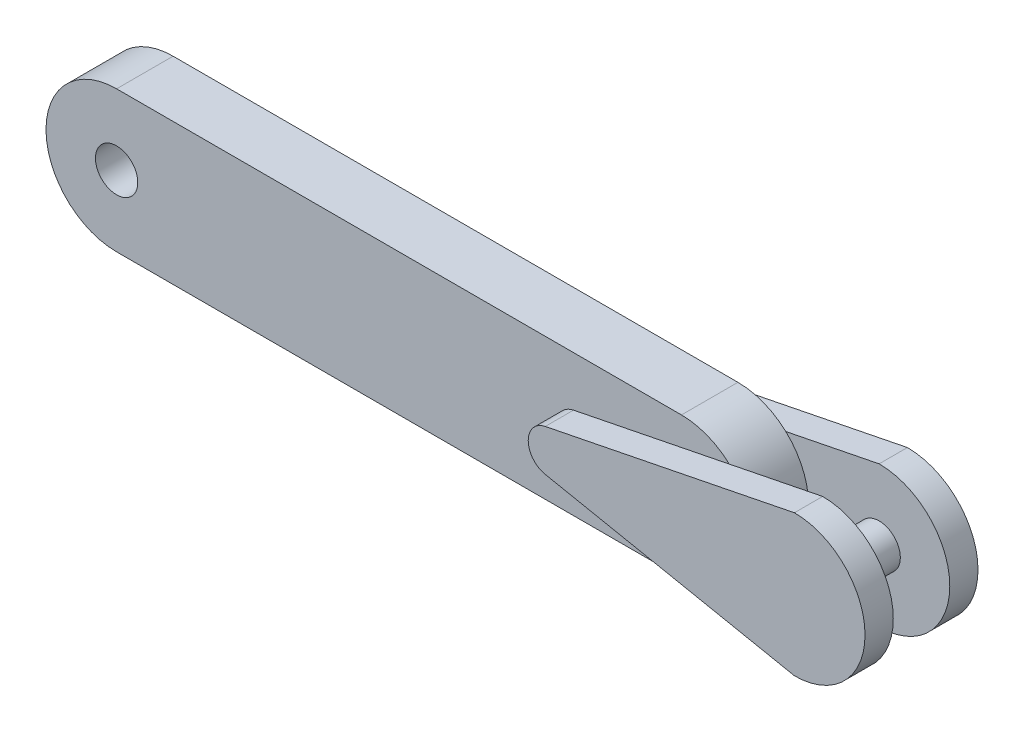
ISO-10303-21;
HEADER;
FILE_DESCRIPTION(('STEP AP214'),'2;1');
FILE_NAME('part.step','',(''),(''),'','','');
FILE_SCHEMA(('AUTOMOTIVE_DESIGN { 1 0 10303 214 1 1 1 1 }'));
ENDSEC;
DATA;
#1=APPLICATION_CONTEXT('core data for automotive mechanical design processes');
#2=APPLICATION_PROTOCOL_DEFINITION('international standard','automotive_design',2000,#1);
#3=PRODUCT_CONTEXT('',#1,'mechanical');
#4=PRODUCT('Part','Part','',(#3));
#5=PRODUCT_RELATED_PRODUCT_CATEGORY('part','',(#4));
#6=PRODUCT_DEFINITION_FORMATION('','',#4);
#7=PRODUCT_DEFINITION_CONTEXT('part definition',#1,'design');
#8=PRODUCT_DEFINITION('design','',#6,#7);
#9=PRODUCT_DEFINITION_SHAPE('','',#8);
#10=(LENGTH_UNIT() NAMED_UNIT(*) SI_UNIT(.MILLI.,.METRE.));
#11=(NAMED_UNIT(*) PLANE_ANGLE_UNIT() SI_UNIT($,.RADIAN.));
#12=(NAMED_UNIT(*) SI_UNIT($,.STERADIAN.) SOLID_ANGLE_UNIT());
#13=UNCERTAINTY_MEASURE_WITH_UNIT(LENGTH_MEASURE(1.E-05),#10,'distance_accuracy_value','');
#14=(GEOMETRIC_REPRESENTATION_CONTEXT(3) GLOBAL_UNCERTAINTY_ASSIGNED_CONTEXT((#13)) GLOBAL_UNIT_ASSIGNED_CONTEXT((#10,
#11,#12)) REPRESENTATION_CONTEXT('',''));
#15=CARTESIAN_POINT('',(0.,0.,0.));
#16=DIRECTION('',(0.,0.,1.));
#17=DIRECTION('',(1.,0.,0.));
#18=AXIS2_PLACEMENT_3D('',#15,#16,#17);
#19=CARTESIAN_POINT('',(0.,-50.,40.));
#20=DIRECTION('',(0.,1.,0.));
#21=DIRECTION('',(-1.,0.,0.));
#22=AXIS2_PLACEMENT_3D('',#19,#20,#21);
#23=PLANE('',#22);
#24=DIRECTION('',(-1.,0.,0.));
#25=VECTOR('',#24,1.);
#26=CARTESIAN_POINT('',(0.,-50.,-20.));
#27=LINE('',#26,#25);
#28=CARTESIAN_POINT('',(400.,-50.,-20.));
#29=VERTEX_POINT('',#28);
#30=CARTESIAN_POINT('',(0.,-50.,-20.));
#31=VERTEX_POINT('',#30);
#32=EDGE_CURVE('E143',#29,#31,#27,.T.);
#33=ORIENTED_EDGE('',*,*,#32,.F.);
#34=DIRECTION('',(0.,0.,1.));
#35=VECTOR('',#34,1.);
#36=CARTESIAN_POINT('',(400.,-50.,-20.));
#37=LINE('',#36,#35);
#38=CARTESIAN_POINT('',(400.,-50.,20.));
#39=VERTEX_POINT('',#38);
#40=EDGE_CURVE('E202',#29,#39,#37,.T.);
#41=ORIENTED_EDGE('',*,*,#40,.T.);
#42=DIRECTION('',(1.,0.,0.));
#43=VECTOR('',#42,1.);
#44=CARTESIAN_POINT('',(0.,-50.,20.));
#45=LINE('',#44,#43);
#46=CARTESIAN_POINT('',(0.,-50.,20.));
#47=VERTEX_POINT('',#46);
#48=EDGE_CURVE('E214',#47,#39,#45,.T.);
#49=ORIENTED_EDGE('',*,*,#48,.F.);
#50=DIRECTION('',(0.,0.,-1.));
#51=VECTOR('',#50,1.);
#52=CARTESIAN_POINT('',(0.,-50.,40.));
#53=LINE('',#52,#51);
#54=EDGE_CURVE('E175',#47,#31,#53,.T.);
#55=ORIENTED_EDGE('',*,*,#54,.T.);
#56=EDGE_LOOP('',(#33,#41,#49,#55));
#57=FACE_BOUND('',#56,.T.);
#58=ADVANCED_FACE('F38',(#57),#23,.F.);
#59=CARTESIAN_POINT('',(0.,50.,40.));
#60=DIRECTION('',(0.,-1.,0.));
#61=DIRECTION('',(1.,0.,0.));
#62=AXIS2_PLACEMENT_3D('',#59,#60,#61);
#63=PLANE('',#62);
#64=DIRECTION('',(1.,0.,0.));
#65=VECTOR('',#64,1.);
#66=CARTESIAN_POINT('',(500.,50.0000000000001,-20.));
#67=LINE('',#66,#65);
#68=CARTESIAN_POINT('',(0.,50.,-20.));
#69=VERTEX_POINT('',#68);
#70=CARTESIAN_POINT('',(400.,50.0000000000001,-20.));
#71=VERTEX_POINT('',#70);
#72=EDGE_CURVE('E140',#69,#71,#67,.T.);
#73=ORIENTED_EDGE('',*,*,#72,.F.);
#74=DIRECTION('',(0.,0.,-1.));
#75=VECTOR('',#74,1.);
#76=CARTESIAN_POINT('',(0.,50.,40.));
#77=LINE('',#76,#75);
#78=CARTESIAN_POINT('',(0.,50.,20.));
#79=VERTEX_POINT('',#78);
#80=EDGE_CURVE('E155',#79,#69,#77,.T.);
#81=ORIENTED_EDGE('',*,*,#80,.F.);
#82=DIRECTION('',(-1.,0.,0.));
#83=VECTOR('',#82,1.);
#84=CARTESIAN_POINT('',(500.,50.0000000000001,20.));
#85=LINE('',#84,#83);
#86=CARTESIAN_POINT('',(400.,50.0000000000001,20.));
#87=VERTEX_POINT('',#86);
#88=EDGE_CURVE('E237',#87,#79,#85,.T.);
#89=ORIENTED_EDGE('',*,*,#88,.F.);
#90=DIRECTION('',(0.,0.,1.));
#91=VECTOR('',#90,1.);
#92=CARTESIAN_POINT('',(400.,50.,-20.));
#93=LINE('',#92,#91);
#94=EDGE_CURVE('E157',#71,#87,#93,.T.);
#95=ORIENTED_EDGE('',*,*,#94,.F.);
#96=EDGE_LOOP('',(#73,#81,#89,#95));
#97=FACE_BOUND('',#96,.T.);
#98=ADVANCED_FACE('F153',(#97),#63,.F.);
#99=CARTESIAN_POINT('',(0.,0.,40.));
#100=DIRECTION('',(0.,0.,-1.));
#101=DIRECTION('',(-1.,0.,0.));
#102=AXIS2_PLACEMENT_3D('',#99,#100,#101);
#103=CYLINDRICAL_SURFACE('',#102,50.);
#104=CARTESIAN_POINT('',(0.,0.,-20.));
#105=DIRECTION('',(0.,0.,-1.));
#106=DIRECTION('',(-1.,0.,0.));
#107=AXIS2_PLACEMENT_3D('',#104,#105,#106);
#108=CIRCLE('',#107,50.);
#109=EDGE_CURVE('E137',#31,#69,#108,.T.);
#110=ORIENTED_EDGE('',*,*,#109,.F.);
#111=ORIENTED_EDGE('',*,*,#54,.F.);
#112=CARTESIAN_POINT('',(0.,0.,20.));
#113=DIRECTION('',(0.,0.,1.));
#114=DIRECTION('',(1.,0.,0.));
#115=AXIS2_PLACEMENT_3D('',#112,#113,#114);
#116=CIRCLE('',#115,50.);
#117=EDGE_CURVE('E160',#79,#47,#116,.T.);
#118=ORIENTED_EDGE('',*,*,#117,.F.);
#119=ORIENTED_EDGE('',*,*,#80,.T.);
#120=EDGE_LOOP('',(#110,#111,#118,#119));
#121=FACE_BOUND('',#120,.T.);
#122=ADVANCED_FACE('F40',(#121),#103,.T.);
#123=CARTESIAN_POINT('',(500.,0.,40.));
#124=DIRECTION('',(0.,0.,-1.));
#125=DIRECTION('',(-1.,0.,0.));
#126=AXIS2_PLACEMENT_3D('',#123,#124,#125);
#127=CYLINDRICAL_SURFACE('',#126,50.);
#128=CARTESIAN_POINT('',(500.,0.,-20.));
#129=DIRECTION('',(0.,0.,1.));
#130=DIRECTION('',(1.,0.,0.));
#131=AXIS2_PLACEMENT_3D('',#128,#129,#130);
#132=CIRCLE('',#131,50.);
#133=CARTESIAN_POINT('',(500.,-50.,-20.));
#134=VERTEX_POINT('',#133);
#135=CARTESIAN_POINT('',(500.,50.0000000000001,-20.));
#136=VERTEX_POINT('',#135);
#137=EDGE_CURVE('E197',#134,#136,#132,.T.);
#138=ORIENTED_EDGE('',*,*,#137,.F.);
#139=DIRECTION('',(0.,0.,-1.));
#140=VECTOR('',#139,1.);
#141=CARTESIAN_POINT('',(500.,-50.,40.));
#142=LINE('',#141,#140);
#143=CARTESIAN_POINT('',(500.,-50.,-40.));
#144=VERTEX_POINT('',#143);
#145=EDGE_CURVE('E171',#134,#144,#142,.T.);
#146=ORIENTED_EDGE('',*,*,#145,.T.);
#147=CARTESIAN_POINT('',(500.,0.,-40.));
#148=DIRECTION('',(0.,0.,1.));
#149=DIRECTION('',(1.,0.,0.));
#150=AXIS2_PLACEMENT_3D('',#147,#148,#149);
#151=CIRCLE('',#150,50.);
#152=CARTESIAN_POINT('',(500.,50.0000000000001,-40.));
#153=VERTEX_POINT('',#152);
#154=EDGE_CURVE('E167',#144,#153,#151,.T.);
#155=ORIENTED_EDGE('',*,*,#154,.T.);
#156=DIRECTION('',(0.,0.,-1.));
#157=VECTOR('',#156,1.);
#158=CARTESIAN_POINT('',(500.,50.0000000000001,40.));
#159=LINE('',#158,#157);
#160=EDGE_CURVE('E161',#136,#153,#159,.T.);
#161=ORIENTED_EDGE('',*,*,#160,.F.);
#162=EDGE_LOOP('',(#138,#146,#155,#161));
#163=FACE_BOUND('',#162,.T.);
#164=ADVANCED_FACE('F264',(#163),#127,.T.);
#165=CARTESIAN_POINT('',(500.,-50.,40.));
#166=VERTEX_POINT('',#165);
#167=CARTESIAN_POINT('',(500.,-50.,20.));
#168=VERTEX_POINT('',#167);
#169=EDGE_CURVE('E172',#166,#168,#142,.T.);
#170=ORIENTED_EDGE('',*,*,#169,.T.);
#171=CARTESIAN_POINT('',(500.,0.,20.));
#172=DIRECTION('',(0.,0.,1.));
#173=DIRECTION('',(1.,0.,0.));
#174=AXIS2_PLACEMENT_3D('',#171,#172,#173);
#175=CIRCLE('',#174,50.);
#176=CARTESIAN_POINT('',(500.,50.0000000000001,20.));
#177=VERTEX_POINT('',#176);
#178=EDGE_CURVE('E206',#168,#177,#175,.T.);
#179=ORIENTED_EDGE('',*,*,#178,.T.);
#180=CARTESIAN_POINT('',(500.,50.0000000000001,40.));
#181=VERTEX_POINT('',#180);
#182=EDGE_CURVE('E164',#181,#177,#159,.T.);
#183=ORIENTED_EDGE('',*,*,#182,.F.);
#184=CARTESIAN_POINT('',(500.,0.,40.));
#185=DIRECTION('',(0.,0.,1.));
#186=DIRECTION('',(1.,0.,0.));
#187=AXIS2_PLACEMENT_3D('',#184,#185,#186);
#188=CIRCLE('',#187,50.);
#189=EDGE_CURVE('E162',#166,#181,#188,.T.);
#190=ORIENTED_EDGE('',*,*,#189,.F.);
#191=EDGE_LOOP('',(#170,#179,#183,#190));
#192=FACE_BOUND('',#191,.T.);
#193=ADVANCED_FACE('F262',(#192),#127,.T.);
#194=CARTESIAN_POINT('',(0.,0.,40.));
#195=DIRECTION('',(0.,0.,1.));
#196=DIRECTION('',(1.,0.,0.));
#197=AXIS2_PLACEMENT_3D('',#194,#195,#196);
#198=PLANE('',#197);
#199=DIRECTION('',(0.98058067569092,0.196116135138184,0.));
#200=VECTOR('',#199,1.);
#201=CARTESIAN_POINT('',(500.,50.0000000000001,40.));
#202=LINE('',#201,#200);
#203=CARTESIAN_POINT('',(323.543550676819,14.7087101353639,40.));
#204=VERTEX_POINT('',#203);
#205=EDGE_CURVE('E246',#204,#181,#202,.T.);
#206=ORIENTED_EDGE('',*,*,#205,.F.);
#207=CARTESIAN_POINT('',(326.485292703892,0.,40.));
#208=DIRECTION('',(0.,0.,-1.));
#209=DIRECTION('',(1.,0.,0.));
#210=AXIS2_PLACEMENT_3D('',#207,#208,#209);
#211=CIRCLE('',#210,15.0000000000001);
#212=CARTESIAN_POINT('',(323.543550676819,-14.7087101353639,40.));
#213=VERTEX_POINT('',#212);
#214=EDGE_CURVE('E242',#213,#204,#211,.T.);
#215=ORIENTED_EDGE('',*,*,#214,.F.);
#216=DIRECTION('',(-0.98058067569092,0.196116135138184,0.));
#217=VECTOR('',#216,1.);
#218=CARTESIAN_POINT('',(323.543550676819,-14.7087101353639,40.));
#219=LINE('',#218,#217);
#220=EDGE_CURVE('E239',#166,#213,#219,.T.);
#221=ORIENTED_EDGE('',*,*,#220,.F.);
#222=ORIENTED_EDGE('',*,*,#189,.T.);
#223=EDGE_LOOP('',(#206,#215,#221,#222));
#224=FACE_BOUND('',#223,.T.);
#225=ADVANCED_FACE('F258',(#224),#198,.T.);
#226=CARTESIAN_POINT('',(0.,0.,-40.));
#227=DIRECTION('',(0.,0.,1.));
#228=DIRECTION('',(1.,0.,0.));
#229=AXIS2_PLACEMENT_3D('',#226,#227,#228);
#230=PLANE('',#229);
#231=ORIENTED_EDGE('',*,*,#154,.F.);
#232=DIRECTION('',(0.98058067569092,-0.196116135138184,0.));
#233=VECTOR('',#232,1.);
#234=CARTESIAN_POINT('',(323.543550676819,-14.7087101353638,-40.));
#235=LINE('',#234,#233);
#236=CARTESIAN_POINT('',(323.543550676819,-14.7087101353638,-40.));
#237=VERTEX_POINT('',#236);
#238=EDGE_CURVE('E148',#237,#144,#235,.T.);
#239=ORIENTED_EDGE('',*,*,#238,.F.);
#240=CARTESIAN_POINT('',(326.485292703892,0.,-40.));
#241=DIRECTION('',(0.,0.,1.));
#242=DIRECTION('',(-1.,0.,0.));
#243=AXIS2_PLACEMENT_3D('',#240,#241,#242);
#244=CIRCLE('',#243,15.);
#245=CARTESIAN_POINT('',(323.543550676819,14.7087101353638,-40.));
#246=VERTEX_POINT('',#245);
#247=EDGE_CURVE('E349',#246,#237,#244,.T.);
#248=ORIENTED_EDGE('',*,*,#247,.F.);
#249=DIRECTION('',(-0.98058067569092,-0.196116135138184,0.));
#250=VECTOR('',#249,1.);
#251=CARTESIAN_POINT('',(500.,50.0000000000001,-40.));
#252=LINE('',#251,#250);
#253=EDGE_CURVE('E333',#153,#246,#252,.T.);
#254=ORIENTED_EDGE('',*,*,#253,.F.);
#255=EDGE_LOOP('',(#231,#239,#248,#254));
#256=FACE_BOUND('',#255,.T.);
#257=ADVANCED_FACE('F270',(#256),#230,.F.);
#258=CARTESIAN_POINT('',(400.,0.,-20.));
#259=DIRECTION('',(0.,0.,1.));
#260=DIRECTION('',(1.,0.,0.));
#261=AXIS2_PLACEMENT_3D('',#258,#259,#260);
#262=CYLINDRICAL_SURFACE('',#261,50.);
#263=CARTESIAN_POINT('',(400.,0.,20.));
#264=DIRECTION('',(0.,0.,-1.));
#265=DIRECTION('',(1.,0.,0.));
#266=AXIS2_PLACEMENT_3D('',#263,#264,#265);
#267=CIRCLE('',#266,50.);
#268=CARTESIAN_POINT('',(433.876015630939,36.7752031261879,20.));
#269=VERTEX_POINT('',#268);
#270=EDGE_CURVE('E203',#87,#269,#267,.T.);
#271=ORIENTED_EDGE('',*,*,#270,.T.);
#272=CARTESIAN_POINT('',(433.876015630939,-36.7752031261879,20.));
#273=VERTEX_POINT('',#272);
#274=EDGE_CURVE('E207',#269,#273,#267,.T.);
#275=ORIENTED_EDGE('',*,*,#274,.T.);
#276=EDGE_CURVE('E180',#273,#39,#267,.T.);
#277=ORIENTED_EDGE('',*,*,#276,.T.);
#278=ORIENTED_EDGE('',*,*,#40,.F.);
#279=CARTESIAN_POINT('',(400.,0.,-20.));
#280=DIRECTION('',(0.,0.,-1.));
#281=DIRECTION('',(1.,0.,0.));
#282=AXIS2_PLACEMENT_3D('',#279,#280,#281);
#283=CIRCLE('',#282,50.);
#284=CARTESIAN_POINT('',(433.876015630939,-36.7752031261878,-20.));
#285=VERTEX_POINT('',#284);
#286=EDGE_CURVE('E199',#285,#29,#283,.T.);
#287=ORIENTED_EDGE('',*,*,#286,.F.);
#288=CARTESIAN_POINT('',(433.876015630939,36.7752031261879,-20.));
#289=VERTEX_POINT('',#288);
#290=EDGE_CURVE('E198',#289,#285,#283,.T.);
#291=ORIENTED_EDGE('',*,*,#290,.F.);
#292=EDGE_CURVE('E195',#71,#289,#283,.T.);
#293=ORIENTED_EDGE('',*,*,#292,.F.);
#294=ORIENTED_EDGE('',*,*,#94,.T.);
#295=EDGE_LOOP('',(#271,#275,#277,#278,#287,#291,#293,#294));
#296=FACE_BOUND('',#295,.T.);
#297=ADVANCED_FACE('F218',(#296),#262,.T.);
#298=CARTESIAN_POINT('',(400.,0.,-20.));
#299=DIRECTION('',(0.,0.,1.));
#300=DIRECTION('',(1.,0.,0.));
#301=AXIS2_PLACEMENT_3D('',#298,#299,#300);
#302=PLANE('',#301);
#303=DIRECTION('',(-0.98058067569092,0.196116135138184,0.));
#304=VECTOR('',#303,1.);
#305=CARTESIAN_POINT('',(394.230769230769,-28.8461538461539,-20.));
#306=LINE('',#305,#304);
#307=EDGE_CURVE('E11',#134,#285,#306,.T.);
#308=ORIENTED_EDGE('',*,*,#307,.F.);
#309=ORIENTED_EDGE('',*,*,#137,.T.);
#310=DIRECTION('',(-0.98058067569092,-0.196116135138184,0.));
#311=VECTOR('',#310,1.);
#312=CARTESIAN_POINT('',(500.,50.0000000000001,-20.));
#313=LINE('',#312,#311);
#314=EDGE_CURVE('E336',#136,#289,#313,.T.);
#315=ORIENTED_EDGE('',*,*,#314,.T.);
#316=ORIENTED_EDGE('',*,*,#290,.T.);
#317=EDGE_LOOP('',(#308,#309,#315,#316));
#318=FACE_BOUND('',#317,.T.);
#319=CARTESIAN_POINT('',(500.,0.,-20.));
#320=DIRECTION('',(0.,0.,1.));
#321=DIRECTION('',(1.,0.,0.));
#322=AXIS2_PLACEMENT_3D('',#319,#320,#321);
#323=CIRCLE('',#322,15.);
#324=CARTESIAN_POINT('',(515.,0.,-20.));
#325=VERTEX_POINT('',#324);
#326=EDGE_CURVE('E177',#325,#325,#323,.T.);
#327=ORIENTED_EDGE('',*,*,#326,.F.);
#328=EDGE_LOOP('',(#327));
#329=FACE_BOUND('',#328,.T.);
#330=ADVANCED_FACE('F287',(#318,#329),#302,.T.);
#331=CARTESIAN_POINT('',(400.,0.,20.));
#332=DIRECTION('',(0.,0.,1.));
#333=DIRECTION('',(1.,0.,0.));
#334=AXIS2_PLACEMENT_3D('',#331,#332,#333);
#335=PLANE('',#334);
#336=CARTESIAN_POINT('',(500.,0.,20.));
#337=DIRECTION('',(0.,0.,1.));
#338=DIRECTION('',(1.,0.,0.));
#339=AXIS2_PLACEMENT_3D('',#336,#337,#338);
#340=CIRCLE('',#339,15.);
#341=CARTESIAN_POINT('',(515.,0.,20.));
#342=VERTEX_POINT('',#341);
#343=EDGE_CURVE('E178',#342,#342,#340,.T.);
#344=ORIENTED_EDGE('',*,*,#343,.T.);
#345=EDGE_LOOP('',(#344));
#346=FACE_BOUND('',#345,.T.);
#347=ORIENTED_EDGE('',*,*,#274,.F.);
#348=DIRECTION('',(0.98058067569092,0.196116135138184,0.));
#349=VECTOR('',#348,1.);
#350=CARTESIAN_POINT('',(394.230769230769,28.846153846154,20.));
#351=LINE('',#350,#349);
#352=EDGE_CURVE('E46',#269,#177,#351,.T.);
#353=ORIENTED_EDGE('',*,*,#352,.T.);
#354=ORIENTED_EDGE('',*,*,#178,.F.);
#355=DIRECTION('',(-0.98058067569092,0.196116135138184,0.));
#356=VECTOR('',#355,1.);
#357=CARTESIAN_POINT('',(323.543550676819,-14.7087101353639,20.));
#358=LINE('',#357,#356);
#359=EDGE_CURVE('E226',#168,#273,#358,.T.);
#360=ORIENTED_EDGE('',*,*,#359,.T.);
#361=EDGE_LOOP('',(#347,#353,#354,#360));
#362=FACE_BOUND('',#361,.T.);
#363=ADVANCED_FACE('F227',(#346,#362),#335,.F.);
#364=CARTESIAN_POINT('',(500.,0.,-40.));
#365=DIRECTION('',(0.,0.,1.));
#366=DIRECTION('',(1.,0.,0.));
#367=AXIS2_PLACEMENT_3D('',#364,#365,#366);
#368=CYLINDRICAL_SURFACE('',#367,15.);
#369=ORIENTED_EDGE('',*,*,#326,.T.);
#370=EDGE_LOOP('',(#369));
#371=FACE_BOUND('',#370,.T.);
#372=ORIENTED_EDGE('',*,*,#343,.F.);
#373=EDGE_LOOP('',(#372));
#374=FACE_BOUND('',#373,.T.);
#375=ADVANCED_FACE('F290',(#371,#374),#368,.T.);
#376=CARTESIAN_POINT('',(0.,0.,20.));
#377=DIRECTION('',(0.,0.,1.));
#378=DIRECTION('',(1.,0.,0.));
#379=AXIS2_PLACEMENT_3D('',#376,#377,#378);
#380=PLANE('',#379);
#381=CARTESIAN_POINT('',(0.,0.,20.));
#382=DIRECTION('',(0.,0.,-1.));
#383=DIRECTION('',(-1.,0.,0.));
#384=AXIS2_PLACEMENT_3D('',#381,#382,#383);
#385=CIRCLE('',#384,15.);
#386=CARTESIAN_POINT('',(-15.,0.,20.));
#387=VERTEX_POINT('',#386);
#388=EDGE_CURVE('E328',#387,#387,#385,.T.);
#389=ORIENTED_EDGE('',*,*,#388,.T.);
#390=EDGE_LOOP('',(#389));
#391=FACE_BOUND('',#390,.T.);
#392=ORIENTED_EDGE('',*,*,#270,.F.);
#393=ORIENTED_EDGE('',*,*,#88,.T.);
#394=ORIENTED_EDGE('',*,*,#117,.T.);
#395=ORIENTED_EDGE('',*,*,#48,.T.);
#396=ORIENTED_EDGE('',*,*,#276,.F.);
#397=CARTESIAN_POINT('',(323.543550676819,-14.7087101353639,20.));
#398=VERTEX_POINT('',#397);
#399=EDGE_CURVE('E61',#273,#398,#358,.T.);
#400=ORIENTED_EDGE('',*,*,#399,.T.);
#401=CARTESIAN_POINT('',(326.485292703892,0.,20.));
#402=DIRECTION('',(0.,0.,-1.));
#403=DIRECTION('',(1.,0.,0.));
#404=AXIS2_PLACEMENT_3D('',#401,#402,#403);
#405=CIRCLE('',#404,15.0000000000001);
#406=CARTESIAN_POINT('',(323.543550676819,14.7087101353639,20.));
#407=VERTEX_POINT('',#406);
#408=EDGE_CURVE('E228',#398,#407,#405,.T.);
#409=ORIENTED_EDGE('',*,*,#408,.T.);
#410=DIRECTION('',(0.98058067569092,0.196116135138184,0.));
#411=VECTOR('',#410,1.);
#412=CARTESIAN_POINT('',(500.,50.0000000000001,20.));
#413=LINE('',#412,#411);
#414=EDGE_CURVE('E230',#407,#269,#413,.T.);
#415=ORIENTED_EDGE('',*,*,#414,.T.);
#416=EDGE_LOOP('',(#392,#393,#394,#395,#396,#400,#409,#415));
#417=FACE_BOUND('',#416,.T.);
#418=ADVANCED_FACE('F224',(#391,#417),#380,.T.);
#419=CARTESIAN_POINT('',(500.,50.0000000000001,20.));
#420=DIRECTION('',(0.196116135138184,-0.98058067569092,0.));
#421=DIRECTION('',(0.98058067569092,0.196116135138184,0.));
#422=AXIS2_PLACEMENT_3D('',#419,#420,#421);
#423=PLANE('',#422);
#424=ORIENTED_EDGE('',*,*,#205,.T.);
#425=ORIENTED_EDGE('',*,*,#182,.T.);
#426=ORIENTED_EDGE('',*,*,#352,.F.);
#427=ORIENTED_EDGE('',*,*,#414,.F.);
#428=DIRECTION('',(0.,0.,1.));
#429=VECTOR('',#428,1.);
#430=CARTESIAN_POINT('',(323.543550676819,14.7087101353639,20.));
#431=LINE('',#430,#429);
#432=EDGE_CURVE('E181',#407,#204,#431,.T.);
#433=ORIENTED_EDGE('',*,*,#432,.T.);
#434=EDGE_LOOP('',(#424,#425,#426,#427,#433));
#435=FACE_BOUND('',#434,.T.);
#436=ADVANCED_FACE('F260',(#435),#423,.F.);
#437=CARTESIAN_POINT('',(326.485292703892,0.,20.));
#438=DIRECTION('',(0.,0.,1.));
#439=DIRECTION('',(1.,0.,0.));
#440=AXIS2_PLACEMENT_3D('',#437,#438,#439);
#441=CYLINDRICAL_SURFACE('',#440,15.0000000000001);
#442=ORIENTED_EDGE('',*,*,#214,.T.);
#443=ORIENTED_EDGE('',*,*,#432,.F.);
#444=ORIENTED_EDGE('',*,*,#408,.F.);
#445=DIRECTION('',(0.,0.,1.));
#446=VECTOR('',#445,1.);
#447=CARTESIAN_POINT('',(323.543550676819,-14.7087101353639,20.));
#448=LINE('',#447,#446);
#449=EDGE_CURVE('E193',#398,#213,#448,.T.);
#450=ORIENTED_EDGE('',*,*,#449,.T.);
#451=EDGE_LOOP('',(#442,#443,#444,#450));
#452=FACE_BOUND('',#451,.T.);
#453=ADVANCED_FACE('F251',(#452),#441,.T.);
#454=CARTESIAN_POINT('',(323.543550676819,-14.7087101353639,20.));
#455=DIRECTION('',(0.196116135138184,0.98058067569092,0.));
#456=DIRECTION('',(-0.98058067569092,0.196116135138184,0.));
#457=AXIS2_PLACEMENT_3D('',#454,#455,#456);
#458=PLANE('',#457);
#459=ORIENTED_EDGE('',*,*,#220,.T.);
#460=ORIENTED_EDGE('',*,*,#449,.F.);
#461=ORIENTED_EDGE('',*,*,#399,.F.);
#462=ORIENTED_EDGE('',*,*,#359,.F.);
#463=ORIENTED_EDGE('',*,*,#169,.F.);
#464=EDGE_LOOP('',(#459,#460,#461,#462,#463));
#465=FACE_BOUND('',#464,.T.);
#466=ADVANCED_FACE('F255',(#465),#458,.F.);
#467=CARTESIAN_POINT('',(0.,0.,-20.));
#468=DIRECTION('',(0.,0.,-1.));
#469=DIRECTION('',(-1.,0.,0.));
#470=AXIS2_PLACEMENT_3D('',#467,#468,#469);
#471=PLANE('',#470);
#472=CARTESIAN_POINT('',(0.,0.,-20.));
#473=DIRECTION('',(0.,0.,-1.));
#474=DIRECTION('',(-1.,0.,0.));
#475=AXIS2_PLACEMENT_3D('',#472,#473,#474);
#476=CIRCLE('',#475,15.);
#477=CARTESIAN_POINT('',(-15.,0.,-20.));
#478=VERTEX_POINT('',#477);
#479=EDGE_CURVE('E331',#478,#478,#476,.T.);
#480=ORIENTED_EDGE('',*,*,#479,.F.);
#481=EDGE_LOOP('',(#480));
#482=FACE_BOUND('',#481,.T.);
#483=ORIENTED_EDGE('',*,*,#292,.T.);
#484=CARTESIAN_POINT('',(323.543550676819,14.7087101353638,-20.));
#485=VERTEX_POINT('',#484);
#486=EDGE_CURVE('E53',#289,#485,#313,.T.);
#487=ORIENTED_EDGE('',*,*,#486,.T.);
#488=CARTESIAN_POINT('',(326.485292703892,0.,-20.));
#489=DIRECTION('',(0.,0.,1.));
#490=DIRECTION('',(-1.,0.,0.));
#491=AXIS2_PLACEMENT_3D('',#488,#489,#490);
#492=CIRCLE('',#491,15.);
#493=CARTESIAN_POINT('',(323.543550676819,-14.7087101353638,-20.));
#494=VERTEX_POINT('',#493);
#495=EDGE_CURVE('E339',#485,#494,#492,.T.);
#496=ORIENTED_EDGE('',*,*,#495,.T.);
#497=DIRECTION('',(0.98058067569092,-0.196116135138184,0.));
#498=VECTOR('',#497,1.);
#499=CARTESIAN_POINT('',(323.543550676819,-14.7087101353638,-20.));
#500=LINE('',#499,#498);
#501=EDGE_CURVE('E342',#494,#285,#500,.T.);
#502=ORIENTED_EDGE('',*,*,#501,.T.);
#503=ORIENTED_EDGE('',*,*,#286,.T.);
#504=ORIENTED_EDGE('',*,*,#32,.T.);
#505=ORIENTED_EDGE('',*,*,#109,.T.);
#506=ORIENTED_EDGE('',*,*,#72,.T.);
#507=EDGE_LOOP('',(#483,#487,#496,#502,#503,#504,#505,#506));
#508=FACE_BOUND('',#507,.T.);
#509=ADVANCED_FACE('F139',(#482,#508),#471,.T.);
#510=CARTESIAN_POINT('',(323.543550676819,-14.7087101353638,-20.));
#511=DIRECTION('',(0.196116135138184,0.98058067569092,0.));
#512=DIRECTION('',(-0.98058067569092,0.196116135138184,0.));
#513=AXIS2_PLACEMENT_3D('',#510,#511,#512);
#514=PLANE('',#513);
#515=ORIENTED_EDGE('',*,*,#238,.T.);
#516=ORIENTED_EDGE('',*,*,#145,.F.);
#517=ORIENTED_EDGE('',*,*,#307,.T.);
#518=ORIENTED_EDGE('',*,*,#501,.F.);
#519=DIRECTION('',(0.,0.,-1.));
#520=VECTOR('',#519,1.);
#521=CARTESIAN_POINT('',(323.543550676819,-14.7087101353638,-20.));
#522=LINE('',#521,#520);
#523=EDGE_CURVE('E243',#494,#237,#522,.T.);
#524=ORIENTED_EDGE('',*,*,#523,.T.);
#525=EDGE_LOOP('',(#515,#516,#517,#518,#524));
#526=FACE_BOUND('',#525,.T.);
#527=ADVANCED_FACE('F313',(#526),#514,.F.);
#528=CARTESIAN_POINT('',(326.485292703892,0.,-20.));
#529=DIRECTION('',(0.,0.,-1.));
#530=DIRECTION('',(-1.,0.,0.));
#531=AXIS2_PLACEMENT_3D('',#528,#529,#530);
#532=CYLINDRICAL_SURFACE('',#531,15.);
#533=ORIENTED_EDGE('',*,*,#247,.T.);
#534=ORIENTED_EDGE('',*,*,#523,.F.);
#535=ORIENTED_EDGE('',*,*,#495,.F.);
#536=DIRECTION('',(0.,0.,-1.));
#537=VECTOR('',#536,1.);
#538=CARTESIAN_POINT('',(323.543550676819,14.7087101353638,-20.));
#539=LINE('',#538,#537);
#540=EDGE_CURVE('E346',#485,#246,#539,.T.);
#541=ORIENTED_EDGE('',*,*,#540,.T.);
#542=EDGE_LOOP('',(#533,#534,#535,#541));
#543=FACE_BOUND('',#542,.T.);
#544=ADVANCED_FACE('F310',(#543),#532,.T.);
#545=CARTESIAN_POINT('',(500.,50.0000000000001,-20.));
#546=DIRECTION('',(0.196116135138184,-0.98058067569092,0.));
#547=DIRECTION('',(0.98058067569092,0.196116135138184,0.));
#548=AXIS2_PLACEMENT_3D('',#545,#546,#547);
#549=PLANE('',#548);
#550=ORIENTED_EDGE('',*,*,#253,.T.);
#551=ORIENTED_EDGE('',*,*,#540,.F.);
#552=ORIENTED_EDGE('',*,*,#486,.F.);
#553=ORIENTED_EDGE('',*,*,#314,.F.);
#554=ORIENTED_EDGE('',*,*,#160,.T.);
#555=EDGE_LOOP('',(#550,#551,#552,#553,#554));
#556=FACE_BOUND('',#555,.T.);
#557=ADVANCED_FACE('F306',(#556),#549,.F.);
#558=CARTESIAN_POINT('',(0.,0.,20.));
#559=DIRECTION('',(0.,0.,-1.));
#560=DIRECTION('',(-1.,0.,0.));
#561=AXIS2_PLACEMENT_3D('',#558,#559,#560);
#562=CYLINDRICAL_SURFACE('',#561,15.);
#563=ORIENTED_EDGE('',*,*,#388,.F.);
#564=EDGE_LOOP('',(#563));
#565=FACE_BOUND('',#564,.T.);
#566=ORIENTED_EDGE('',*,*,#479,.T.);
#567=EDGE_LOOP('',(#566));
#568=FACE_BOUND('',#567,.T.);
#569=ADVANCED_FACE('F309',(#565,#568),#562,.F.);
#570=CLOSED_SHELL('',(#58,#98,#122,#164,#193,#225,#257,#297,#330,#363,#375,#418,#436,#453,#466,
#509,#527,#544,#557,#569));
#571=MANIFOLD_SOLID_BREP('B2',#570);
#572=ADVANCED_BREP_SHAPE_REPRESENTATION('',(#18,#571),#14);
#573=SHAPE_DEFINITION_REPRESENTATION(#9,#572);
ENDSEC;
END-ISO-10303-21;
